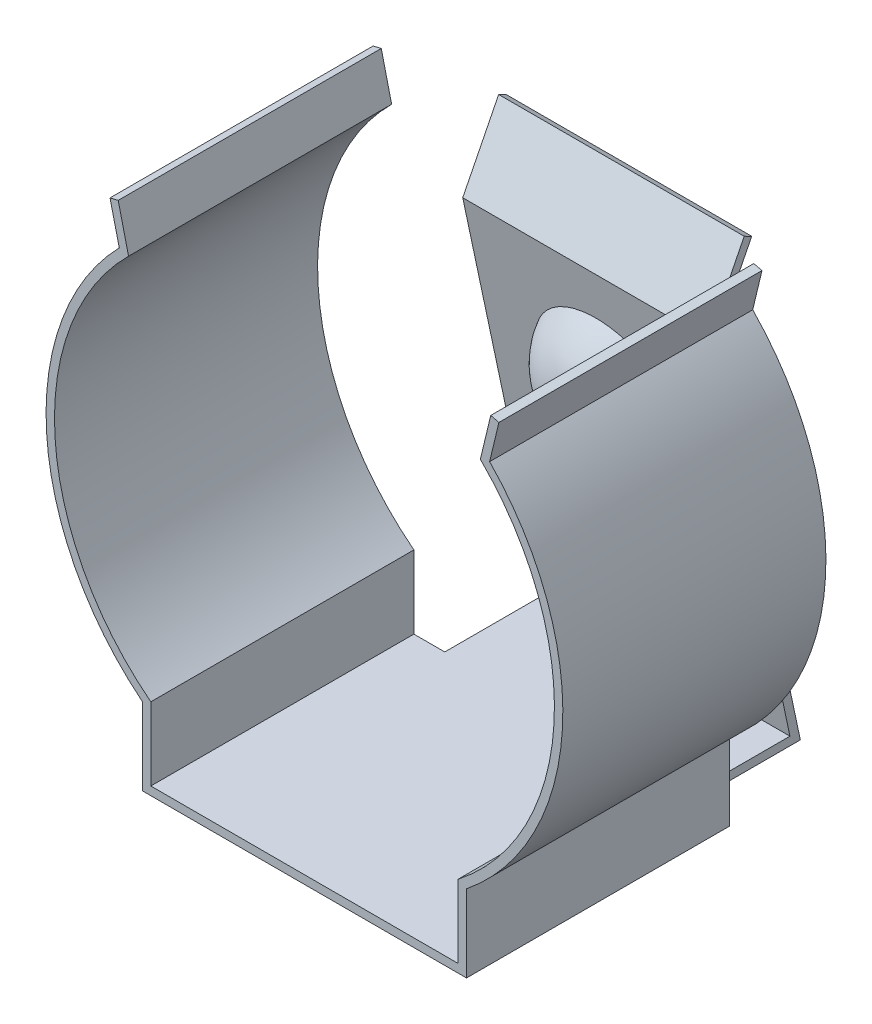
ISO-10303-21;
HEADER;
FILE_DESCRIPTION(('STEP AP214'),'2;1');
FILE_NAME('part.step','',(''),(''),'','','');
FILE_SCHEMA(('AUTOMOTIVE_DESIGN { 1 0 10303 214 1 1 1 1 }'));
ENDSEC;
DATA;
#1=APPLICATION_CONTEXT('core data for automotive mechanical design processes');
#2=APPLICATION_PROTOCOL_DEFINITION('international standard','automotive_design',2000,#1);
#3=PRODUCT_CONTEXT('',#1,'mechanical');
#4=PRODUCT('Part','Part','',(#3));
#5=PRODUCT_RELATED_PRODUCT_CATEGORY('part','',(#4));
#6=PRODUCT_DEFINITION_FORMATION('','',#4);
#7=PRODUCT_DEFINITION_CONTEXT('part definition',#1,'design');
#8=PRODUCT_DEFINITION('design','',#6,#7);
#9=PRODUCT_DEFINITION_SHAPE('','',#8);
#10=(LENGTH_UNIT() NAMED_UNIT(*) SI_UNIT(.MILLI.,.METRE.));
#11=(NAMED_UNIT(*) PLANE_ANGLE_UNIT() SI_UNIT($,.RADIAN.));
#12=(NAMED_UNIT(*) SI_UNIT($,.STERADIAN.) SOLID_ANGLE_UNIT());
#13=UNCERTAINTY_MEASURE_WITH_UNIT(LENGTH_MEASURE(1.E-05),#10,'distance_accuracy_value','');
#14=(GEOMETRIC_REPRESENTATION_CONTEXT(3) GLOBAL_UNCERTAINTY_ASSIGNED_CONTEXT((#13)) GLOBAL_UNIT_ASSIGNED_CONTEXT((#10,
#11,#12)) REPRESENTATION_CONTEXT('',''));
#15=CARTESIAN_POINT('',(0.,0.,0.));
#16=DIRECTION('',(0.,0.,1.));
#17=DIRECTION('',(1.,0.,0.));
#18=AXIS2_PLACEMENT_3D('',#15,#16,#17);
#19=CARTESIAN_POINT('',(4.445,0.,-3.6068));
#20=DIRECTION('',(0.,-0.207792207792208,0.978172990007821));
#21=DIRECTION('',(0.,-0.978172990007821,-0.207792207792208));
#22=AXIS2_PLACEMENT_3D('',#19,#20,#21);
#23=PLANE('',#22);
#24=DIRECTION('',(0.,0.978172990007821,0.207792207792208));
#25=VECTOR('',#24,1.);
#26=CARTESIAN_POINT('',(-4.445,0.,-3.6068));
#27=LINE('',#26,#25);
#28=CARTESIAN_POINT('',(-4.445,0.,-3.6068));
#29=VERTEX_POINT('',#28);
#30=CARTESIAN_POINT('',(-4.445,13.9164511431343,-0.650543655566343));
#31=VERTEX_POINT('',#30);
#32=EDGE_CURVE('E339',#29,#31,#27,.T.);
#33=ORIENTED_EDGE('',*,*,#32,.F.);
#34=DIRECTION('',(-1.,0.,0.));
#35=VECTOR('',#34,1.);
#36=CARTESIAN_POINT('',(4.445,0.,-3.6068));
#37=LINE('',#36,#35);
#38=CARTESIAN_POINT('',(4.445,0.,-3.6068));
#39=VERTEX_POINT('',#38);
#40=EDGE_CURVE('E359',#39,#29,#37,.T.);
#41=ORIENTED_EDGE('',*,*,#40,.F.);
#42=DIRECTION('',(0.,0.978172990007821,0.207792207792208));
#43=VECTOR('',#42,1.);
#44=CARTESIAN_POINT('',(4.445,0.,-3.6068));
#45=LINE('',#44,#43);
#46=CARTESIAN_POINT('',(4.445,13.9164511431343,-0.650543655566343));
#47=VERTEX_POINT('',#46);
#48=EDGE_CURVE('E406',#39,#47,#45,.T.);
#49=ORIENTED_EDGE('',*,*,#48,.T.);
#50=DIRECTION('',(-1.,0.,0.));
#51=VECTOR('',#50,1.);
#52=CARTESIAN_POINT('',(4.445,13.9164511431343,-0.650543655566343));
#53=LINE('',#52,#51);
#54=EDGE_CURVE('E362',#47,#31,#53,.T.);
#55=ORIENTED_EDGE('',*,*,#54,.T.);
#56=EDGE_LOOP('',(#33,#41,#49,#55));
#57=FACE_BOUND('',#56,.T.);
#58=CARTESIAN_POINT('',(2.89696051021412,4.24177401501011,-2.7057246313911));
#59=DIRECTION('',(0.,-0.207792207792208,0.978172990007821));
#60=DIRECTION('',(0.,-0.978172990007821,-0.207792207792208));
#61=AXIS2_PLACEMENT_3D('',#58,#59,#60);
#62=CIRCLE('',#61,0.7874);
#63=CARTESIAN_POINT('',(2.89696051021412,3.47156060267795,-2.86934021580668));
#64=VERTEX_POINT('',#63);
#65=EDGE_CURVE('E430',#64,#64,#62,.T.);
#66=ORIENTED_EDGE('',*,*,#65,.F.);
#67=EDGE_LOOP('',(#66));
#68=FACE_BOUND('',#67,.T.);
#69=CARTESIAN_POINT('',(0.,9.56555366928648,-1.5748));
#70=DIRECTION('',(0.,-0.207792207792208,0.978172990007821));
#71=DIRECTION('',(0.,-0.978172990007821,-0.207792207792208));
#72=AXIS2_PLACEMENT_3D('',#69,#70,#71);
#73=CIRCLE('',#72,2.6797);
#74=CARTESIAN_POINT('',(0.,6.94434350796252,-2.13162077922079));
#75=VERTEX_POINT('',#74);
#76=EDGE_CURVE('E472',#75,#75,#73,.T.);
#77=ORIENTED_EDGE('',*,*,#76,.F.);
#78=EDGE_LOOP('',(#77));
#79=FACE_BOUND('',#78,.T.);
#80=ADVANCED_FACE('F32',(#57,#68,#79),#23,.T.);
#81=CARTESIAN_POINT('',(0.,9.779,0.));
#82=DIRECTION('',(0.,0.,1.));
#83=DIRECTION('',(1.,0.,0.));
#84=AXIS2_PLACEMENT_3D('',#81,#82,#83);
#85=PLANE('',#84);
#86=DIRECTION('',(0.,1.,0.));
#87=VECTOR('',#86,1.);
#88=CARTESIAN_POINT('',(-4.445,-0.304800000000001,0.));
#89=LINE('',#88,#87);
#90=CARTESIAN_POINT('',(-4.445,-0.304800000000001,0.));
#91=VERTEX_POINT('',#90);
#92=CARTESIAN_POINT('',(-4.445,0.,0.));
#93=VERTEX_POINT('',#92);
#94=EDGE_CURVE('E325',#91,#93,#89,.T.);
#95=ORIENTED_EDGE('',*,*,#94,.F.);
#96=DIRECTION('',(1.,0.,0.));
#97=VECTOR('',#96,1.);
#98=CARTESIAN_POINT('',(5.5626,-0.304800000000001,0.));
#99=LINE('',#98,#97);
#100=CARTESIAN_POINT('',(-5.8674,-0.304800000000001,0.));
#101=VERTEX_POINT('',#100);
#102=EDGE_CURVE('E222',#101,#91,#99,.T.);
#103=ORIENTED_EDGE('',*,*,#102,.F.);
#104=DIRECTION('',(0.,-1.,0.));
#105=VECTOR('',#104,1.);
#106=CARTESIAN_POINT('',(-5.8674,2.64037399494833,0.));
#107=LINE('',#106,#105);
#108=CARTESIAN_POINT('',(-5.8674,2.49299284381356,0.));
#109=VERTEX_POINT('',#108);
#110=EDGE_CURVE('E223',#109,#101,#107,.T.);
#111=ORIENTED_EDGE('',*,*,#110,.F.);
#112=CARTESIAN_POINT('',(0.,9.779,0.));
#113=DIRECTION('',(0.,0.,1.));
#114=DIRECTION('',(1.,0.,0.));
#115=AXIS2_PLACEMENT_3D('',#112,#113,#114);
#116=CIRCLE('',#115,9.3548);
#117=CARTESIAN_POINT('',(-6.70456744584664,16.3028836902641,0.));
#118=VERTEX_POINT('',#117);
#119=EDGE_CURVE('E314',#118,#109,#116,.T.);
#120=ORIENTED_EDGE('',*,*,#119,.F.);
#121=DIRECTION('',(0.233312417506239,-0.972401828380323,0.));
#122=VECTOR('',#121,1.);
#123=CARTESIAN_POINT('',(-6.66495860588596,16.1378015707204,0.));
#124=LINE('',#123,#122);
#125=CARTESIAN_POINT('',(-7.04008807729032,17.7012699354644,0.));
#126=VERTEX_POINT('',#125);
#127=EDGE_CURVE('E765',#126,#118,#124,.T.);
#128=ORIENTED_EDGE('',*,*,#127,.F.);
#129=DIRECTION('',(0.972401828380323,0.233312417506236,0.));
#130=VECTOR('',#129,1.);
#131=CARTESIAN_POINT('',(-7.04008807729032,17.7012699354644,0.));
#132=LINE('',#131,#130);
#133=CARTESIAN_POINT('',(-6.7437,17.7723835603203,0.));
#134=VERTEX_POINT('',#133);
#135=EDGE_CURVE('E763',#126,#134,#132,.T.);
#136=ORIENTED_EDGE('',*,*,#135,.T.);
#137=DIRECTION('',(0.233312417506239,-0.972401828380323,0.));
#138=VECTOR('',#137,1.);
#139=CARTESIAN_POINT('',(-6.36857052859564,16.2089151955763,0.));
#140=LINE('',#139,#138);
#141=CARTESIAN_POINT('',(-6.36857052859564,16.2089151955763,0.));
#142=VERTEX_POINT('',#141);
#143=EDGE_CURVE('E760',#134,#142,#140,.T.);
#144=ORIENTED_EDGE('',*,*,#143,.T.);
#145=CARTESIAN_POINT('',(0.,9.779,0.));
#146=DIRECTION('',(0.,0.,1.));
#147=DIRECTION('',(-1.,0.,0.));
#148=AXIS2_PLACEMENT_3D('',#145,#146,#147);
#149=CIRCLE('',#148,9.05);
#150=CARTESIAN_POINT('',(-5.5626,2.64037399494833,0.));
#151=VERTEX_POINT('',#150);
#152=EDGE_CURVE('E757',#142,#151,#149,.T.);
#153=ORIENTED_EDGE('',*,*,#152,.T.);
#154=DIRECTION('',(0.,-1.,0.));
#155=VECTOR('',#154,1.);
#156=CARTESIAN_POINT('',(-5.5626,2.64037399494833,0.));
#157=LINE('',#156,#155);
#158=CARTESIAN_POINT('',(-5.5626,0.,0.));
#159=VERTEX_POINT('',#158);
#160=EDGE_CURVE('E211',#151,#159,#157,.T.);
#161=ORIENTED_EDGE('',*,*,#160,.T.);
#162=DIRECTION('',(1.,0.,0.));
#163=VECTOR('',#162,1.);
#164=CARTESIAN_POINT('',(5.5626,0.,0.));
#165=LINE('',#164,#163);
#166=EDGE_CURVE('E217',#159,#93,#165,.T.);
#167=ORIENTED_EDGE('',*,*,#166,.T.);
#168=EDGE_LOOP('',(#95,#103,#111,#120,#128,#136,#144,#153,#161,#167));
#169=FACE_BOUND('',#168,.T.);
#170=ADVANCED_FACE('F323',(#169),#85,.F.);
#171=CARTESIAN_POINT('',(6.66495860588596,16.1378015707204,9.525));
#172=DIRECTION('',(-0.972401828380323,0.233312417506239,0.));
#173=DIRECTION('',(-0.233312417506239,-0.972401828380323,0.));
#174=AXIS2_PLACEMENT_3D('',#171,#172,#173);
#175=PLANE('',#174);
#176=DIRECTION('',(0.233312417506239,0.972401828380323,0.));
#177=VECTOR('',#176,1.);
#178=CARTESIAN_POINT('',(6.66495860588596,16.1378015707204,0.));
#179=LINE('',#178,#177);
#180=CARTESIAN_POINT('',(6.70456744584664,16.3028836902641,0.));
#181=VERTEX_POINT('',#180);
#182=CARTESIAN_POINT('',(7.04008807729032,17.7012699354644,0.));
#183=VERTEX_POINT('',#182);
#184=EDGE_CURVE('E192',#181,#183,#179,.T.);
#185=ORIENTED_EDGE('',*,*,#184,.T.);
#186=DIRECTION('',(0.,0.,-1.));
#187=VECTOR('',#186,1.);
#188=CARTESIAN_POINT('',(7.04008807729032,17.7012699354644,9.525));
#189=LINE('',#188,#187);
#190=CARTESIAN_POINT('',(7.04008807729032,17.7012699354644,9.525));
#191=VERTEX_POINT('',#190);
#192=EDGE_CURVE('E11',#191,#183,#189,.T.);
#193=ORIENTED_EDGE('',*,*,#192,.F.);
#194=DIRECTION('',(0.233312417506239,0.972401828380323,0.));
#195=VECTOR('',#194,1.);
#196=CARTESIAN_POINT('',(6.66495860588596,16.1378015707204,9.525));
#197=LINE('',#196,#195);
#198=CARTESIAN_POINT('',(6.70456744584664,16.3028836902641,9.525));
#199=VERTEX_POINT('',#198);
#200=EDGE_CURVE('E120',#199,#191,#197,.T.);
#201=ORIENTED_EDGE('',*,*,#200,.F.);
#202=DIRECTION('',(0.,0.,-1.));
#203=VECTOR('',#202,1.);
#204=CARTESIAN_POINT('',(6.70456744584664,16.3028836902641,9.525));
#205=LINE('',#204,#203);
#206=EDGE_CURVE('E188',#199,#181,#205,.T.);
#207=ORIENTED_EDGE('',*,*,#206,.T.);
#208=EDGE_LOOP('',(#185,#193,#201,#207));
#209=FACE_BOUND('',#208,.T.);
#210=ADVANCED_FACE('F34',(#209),#175,.F.);
#211=CARTESIAN_POINT('',(6.7437,17.7723835603203,9.525));
#212=DIRECTION('',(0.233312417506236,0.972401828380323,0.));
#213=DIRECTION('',(-0.972401828380323,0.233312417506236,0.));
#214=AXIS2_PLACEMENT_3D('',#211,#212,#213);
#215=PLANE('',#214);
#216=DIRECTION('',(0.972401828380323,-0.233312417506236,0.));
#217=VECTOR('',#216,1.);
#218=CARTESIAN_POINT('',(6.7437,17.7723835603203,0.));
#219=LINE('',#218,#217);
#220=CARTESIAN_POINT('',(6.7437,17.7723835603203,0.));
#221=VERTEX_POINT('',#220);
#222=EDGE_CURVE('E195',#221,#183,#219,.T.);
#223=ORIENTED_EDGE('',*,*,#222,.F.);
#224=DIRECTION('',(0.,0.,-1.));
#225=VECTOR('',#224,1.);
#226=CARTESIAN_POINT('',(6.7437,17.7723835603203,9.525));
#227=LINE('',#226,#225);
#228=CARTESIAN_POINT('',(6.7437,17.7723835603203,9.525));
#229=VERTEX_POINT('',#228);
#230=EDGE_CURVE('E41',#229,#221,#227,.T.);
#231=ORIENTED_EDGE('',*,*,#230,.F.);
#232=DIRECTION('',(0.972401828380323,-0.233312417506236,0.));
#233=VECTOR('',#232,1.);
#234=CARTESIAN_POINT('',(6.7437,17.7723835603203,9.525));
#235=LINE('',#234,#233);
#236=EDGE_CURVE('E280',#229,#191,#235,.T.);
#237=ORIENTED_EDGE('',*,*,#236,.T.);
#238=ORIENTED_EDGE('',*,*,#192,.T.);
#239=EDGE_LOOP('',(#223,#231,#237,#238));
#240=FACE_BOUND('',#239,.T.);
#241=ADVANCED_FACE('F267',(#240),#215,.T.);
#242=CARTESIAN_POINT('',(6.36857052859564,16.2089151955763,9.525));
#243=DIRECTION('',(-0.972401828380323,0.233312417506239,0.));
#244=DIRECTION('',(-0.233312417506239,-0.972401828380323,0.));
#245=AXIS2_PLACEMENT_3D('',#242,#243,#244);
#246=PLANE('',#245);
#247=DIRECTION('',(0.233312417506239,0.972401828380323,0.));
#248=VECTOR('',#247,1.);
#249=CARTESIAN_POINT('',(6.36857052859564,16.2089151955763,0.));
#250=LINE('',#249,#248);
#251=CARTESIAN_POINT('',(6.36857052859564,16.2089151955763,0.));
#252=VERTEX_POINT('',#251);
#253=EDGE_CURVE('E199',#252,#221,#250,.T.);
#254=ORIENTED_EDGE('',*,*,#253,.F.);
#255=DIRECTION('',(0.,0.,-1.));
#256=VECTOR('',#255,1.);
#257=CARTESIAN_POINT('',(6.36857052859564,16.2089151955763,9.525));
#258=LINE('',#257,#256);
#259=CARTESIAN_POINT('',(6.36857052859564,16.2089151955763,9.525));
#260=VERTEX_POINT('',#259);
#261=EDGE_CURVE('E256',#260,#252,#258,.T.);
#262=ORIENTED_EDGE('',*,*,#261,.F.);
#263=DIRECTION('',(0.233312417506239,0.972401828380323,0.));
#264=VECTOR('',#263,1.);
#265=CARTESIAN_POINT('',(6.36857052859564,16.2089151955763,9.525));
#266=LINE('',#265,#264);
#267=EDGE_CURVE('E264',#260,#229,#266,.T.);
#268=ORIENTED_EDGE('',*,*,#267,.T.);
#269=ORIENTED_EDGE('',*,*,#230,.T.);
#270=EDGE_LOOP('',(#254,#262,#268,#269));
#271=FACE_BOUND('',#270,.T.);
#272=ADVANCED_FACE('F262',(#271),#246,.T.);
#273=CARTESIAN_POINT('',(0.,9.779,9.525));
#274=DIRECTION('',(0.,0.,-1.));
#275=DIRECTION('',(-1.,0.,0.));
#276=AXIS2_PLACEMENT_3D('',#273,#274,#275);
#277=CYLINDRICAL_SURFACE('',#276,9.05);
#278=CARTESIAN_POINT('',(0.,9.779,0.));
#279=DIRECTION('',(0.,0.,1.));
#280=DIRECTION('',(1.,0.,0.));
#281=AXIS2_PLACEMENT_3D('',#278,#279,#280);
#282=CIRCLE('',#281,9.05);
#283=CARTESIAN_POINT('',(5.5626,2.64037399494833,0.));
#284=VERTEX_POINT('',#283);
#285=EDGE_CURVE('E202',#284,#252,#282,.T.);
#286=ORIENTED_EDGE('',*,*,#285,.F.);
#287=DIRECTION('',(0.,0.,-1.));
#288=VECTOR('',#287,1.);
#289=CARTESIAN_POINT('',(5.5626,2.64037399494833,9.525));
#290=LINE('',#289,#288);
#291=CARTESIAN_POINT('',(5.5626,2.64037399494833,9.525));
#292=VERTEX_POINT('',#291);
#293=EDGE_CURVE('E254',#292,#284,#290,.T.);
#294=ORIENTED_EDGE('',*,*,#293,.F.);
#295=CARTESIAN_POINT('',(0.,9.779,9.525));
#296=DIRECTION('',(0.,0.,1.));
#297=DIRECTION('',(1.,0.,0.));
#298=AXIS2_PLACEMENT_3D('',#295,#296,#297);
#299=CIRCLE('',#298,9.05);
#300=EDGE_CURVE('E277',#292,#260,#299,.T.);
#301=ORIENTED_EDGE('',*,*,#300,.T.);
#302=ORIENTED_EDGE('',*,*,#261,.T.);
#303=EDGE_LOOP('',(#286,#294,#301,#302));
#304=FACE_BOUND('',#303,.T.);
#305=ADVANCED_FACE('F274',(#304),#277,.F.);
#306=CARTESIAN_POINT('',(5.5626,2.64037399494833,9.525));
#307=DIRECTION('',(-1.,0.,0.));
#308=DIRECTION('',(0.,-1.,0.));
#309=AXIS2_PLACEMENT_3D('',#306,#307,#308);
#310=PLANE('',#309);
#311=DIRECTION('',(0.,1.,0.));
#312=VECTOR('',#311,1.);
#313=CARTESIAN_POINT('',(5.5626,2.64037399494833,0.));
#314=LINE('',#313,#312);
#315=CARTESIAN_POINT('',(5.5626,0.,0.));
#316=VERTEX_POINT('',#315);
#317=EDGE_CURVE('E205',#316,#284,#314,.T.);
#318=ORIENTED_EDGE('',*,*,#317,.F.);
#319=DIRECTION('',(0.,0.,-1.));
#320=VECTOR('',#319,1.);
#321=CARTESIAN_POINT('',(5.5626,0.,9.525));
#322=LINE('',#321,#320);
#323=CARTESIAN_POINT('',(5.5626,0.,9.525));
#324=VERTEX_POINT('',#323);
#325=EDGE_CURVE('E251',#324,#316,#322,.T.);
#326=ORIENTED_EDGE('',*,*,#325,.F.);
#327=DIRECTION('',(0.,1.,0.));
#328=VECTOR('',#327,1.);
#329=CARTESIAN_POINT('',(5.5626,2.64037399494833,9.525));
#330=LINE('',#329,#328);
#331=EDGE_CURVE('E282',#324,#292,#330,.T.);
#332=ORIENTED_EDGE('',*,*,#331,.T.);
#333=ORIENTED_EDGE('',*,*,#293,.T.);
#334=EDGE_LOOP('',(#318,#326,#332,#333));
#335=FACE_BOUND('',#334,.T.);
#336=ADVANCED_FACE('F552',(#335),#310,.T.);
#337=CARTESIAN_POINT('',(5.5626,0.,9.525));
#338=DIRECTION('',(0.,1.,0.));
#339=DIRECTION('',(0.,0.,1.));
#340=AXIS2_PLACEMENT_3D('',#337,#338,#339);
#341=PLANE('',#340);
#342=ORIENTED_EDGE('',*,*,#166,.F.);
#343=DIRECTION('',(0.,0.,-1.));
#344=VECTOR('',#343,1.);
#345=CARTESIAN_POINT('',(-5.5626,0.,9.525));
#346=LINE('',#345,#344);
#347=CARTESIAN_POINT('',(-5.5626,0.,9.525));
#348=VERTEX_POINT('',#347);
#349=EDGE_CURVE('E249',#348,#159,#346,.T.);
#350=ORIENTED_EDGE('',*,*,#349,.F.);
#351=DIRECTION('',(1.,0.,0.));
#352=VECTOR('',#351,1.);
#353=CARTESIAN_POINT('',(5.5626,0.,9.525));
#354=LINE('',#353,#352);
#355=EDGE_CURVE('E288',#348,#324,#354,.T.);
#356=ORIENTED_EDGE('',*,*,#355,.T.);
#357=ORIENTED_EDGE('',*,*,#325,.T.);
#358=CARTESIAN_POINT('',(4.445,0.,0.));
#359=VERTEX_POINT('',#358);
#360=EDGE_CURVE('E208',#359,#316,#165,.T.);
#361=ORIENTED_EDGE('',*,*,#360,.F.);
#362=DIRECTION('',(0.,0.,-1.));
#363=VECTOR('',#362,1.);
#364=CARTESIAN_POINT('',(4.445,0.,0.));
#365=LINE('',#364,#363);
#366=EDGE_CURVE('E49',#359,#39,#365,.T.);
#367=ORIENTED_EDGE('',*,*,#366,.T.);
#368=ORIENTED_EDGE('',*,*,#40,.T.);
#369=DIRECTION('',(0.,0.,-1.));
#370=VECTOR('',#369,1.);
#371=CARTESIAN_POINT('',(-4.445,0.,0.));
#372=LINE('',#371,#370);
#373=EDGE_CURVE('E335',#93,#29,#372,.T.);
#374=ORIENTED_EDGE('',*,*,#373,.F.);
#375=EDGE_LOOP('',(#342,#350,#356,#357,#361,#367,#368,#374));
#376=FACE_BOUND('',#375,.T.);
#377=ADVANCED_FACE('F449',(#376),#341,.T.);
#378=CARTESIAN_POINT('',(-5.5626,2.64037399494833,9.525));
#379=DIRECTION('',(1.,0.,0.));
#380=DIRECTION('',(0.,1.,0.));
#381=AXIS2_PLACEMENT_3D('',#378,#379,#380);
#382=PLANE('',#381);
#383=ORIENTED_EDGE('',*,*,#160,.F.);
#384=DIRECTION('',(0.,0.,-1.));
#385=VECTOR('',#384,1.);
#386=CARTESIAN_POINT('',(-5.5626,2.64037399494833,9.525));
#387=LINE('',#386,#385);
#388=CARTESIAN_POINT('',(-5.5626,2.64037399494833,9.525));
#389=VERTEX_POINT('',#388);
#390=EDGE_CURVE('E247',#389,#151,#387,.T.);
#391=ORIENTED_EDGE('',*,*,#390,.F.);
#392=DIRECTION('',(0.,-1.,0.));
#393=VECTOR('',#392,1.);
#394=CARTESIAN_POINT('',(-5.5626,2.64037399494833,9.525));
#395=LINE('',#394,#393);
#396=EDGE_CURVE('E291',#389,#348,#395,.T.);
#397=ORIENTED_EDGE('',*,*,#396,.T.);
#398=ORIENTED_EDGE('',*,*,#349,.T.);
#399=EDGE_LOOP('',(#383,#391,#397,#398));
#400=FACE_BOUND('',#399,.T.);
#401=ADVANCED_FACE('F545',(#400),#382,.T.);
#402=CARTESIAN_POINT('',(0.,9.779,9.525));
#403=DIRECTION('',(0.,0.,-1.));
#404=DIRECTION('',(-1.,0.,0.));
#405=AXIS2_PLACEMENT_3D('',#402,#403,#404);
#406=CYLINDRICAL_SURFACE('',#405,9.05);
#407=ORIENTED_EDGE('',*,*,#152,.F.);
#408=DIRECTION('',(0.,0.,-1.));
#409=VECTOR('',#408,1.);
#410=CARTESIAN_POINT('',(-6.36857052859564,16.2089151955763,9.525));
#411=LINE('',#410,#409);
#412=CARTESIAN_POINT('',(-6.36857052859564,16.2089151955763,9.525));
#413=VERTEX_POINT('',#412);
#414=EDGE_CURVE('E245',#413,#142,#411,.T.);
#415=ORIENTED_EDGE('',*,*,#414,.F.);
#416=CARTESIAN_POINT('',(0.,9.779,9.525));
#417=DIRECTION('',(0.,0.,1.));
#418=DIRECTION('',(-1.,0.,0.));
#419=AXIS2_PLACEMENT_3D('',#416,#417,#418);
#420=CIRCLE('',#419,9.05);
#421=EDGE_CURVE('E294',#413,#389,#420,.T.);
#422=ORIENTED_EDGE('',*,*,#421,.T.);
#423=ORIENTED_EDGE('',*,*,#390,.T.);
#424=EDGE_LOOP('',(#407,#415,#422,#423));
#425=FACE_BOUND('',#424,.T.);
#426=ADVANCED_FACE('F541',(#425),#406,.F.);
#427=CARTESIAN_POINT('',(-6.36857052859564,16.2089151955763,9.525));
#428=DIRECTION('',(0.972401828380323,0.233312417506239,0.));
#429=DIRECTION('',(-0.233312417506239,0.972401828380323,0.));
#430=AXIS2_PLACEMENT_3D('',#427,#428,#429);
#431=PLANE('',#430);
#432=ORIENTED_EDGE('',*,*,#143,.F.);
#433=DIRECTION('',(0.,0.,-1.));
#434=VECTOR('',#433,1.);
#435=CARTESIAN_POINT('',(-6.7437,17.7723835603203,9.525));
#436=LINE('',#435,#434);
#437=CARTESIAN_POINT('',(-6.7437,17.7723835603203,9.525));
#438=VERTEX_POINT('',#437);
#439=EDGE_CURVE('E243',#438,#134,#436,.T.);
#440=ORIENTED_EDGE('',*,*,#439,.F.);
#441=DIRECTION('',(0.233312417506239,-0.972401828380323,0.));
#442=VECTOR('',#441,1.);
#443=CARTESIAN_POINT('',(-6.36857052859564,16.2089151955763,9.525));
#444=LINE('',#443,#442);
#445=EDGE_CURVE('E297',#438,#413,#444,.T.);
#446=ORIENTED_EDGE('',*,*,#445,.T.);
#447=ORIENTED_EDGE('',*,*,#414,.T.);
#448=EDGE_LOOP('',(#432,#440,#446,#447));
#449=FACE_BOUND('',#448,.T.);
#450=ADVANCED_FACE('F537',(#449),#431,.T.);
#451=CARTESIAN_POINT('',(-7.04008807729032,17.7012699354644,9.525));
#452=DIRECTION('',(-0.233312417506236,0.972401828380323,0.));
#453=DIRECTION('',(-0.972401828380323,-0.233312417506236,0.));
#454=AXIS2_PLACEMENT_3D('',#451,#452,#453);
#455=PLANE('',#454);
#456=ORIENTED_EDGE('',*,*,#135,.F.);
#457=DIRECTION('',(0.,0.,-1.));
#458=VECTOR('',#457,1.);
#459=CARTESIAN_POINT('',(-7.04008807729032,17.7012699354644,9.525));
#460=LINE('',#459,#458);
#461=CARTESIAN_POINT('',(-7.04008807729032,17.7012699354644,9.525));
#462=VERTEX_POINT('',#461);
#463=EDGE_CURVE('E241',#462,#126,#460,.T.);
#464=ORIENTED_EDGE('',*,*,#463,.F.);
#465=DIRECTION('',(0.972401828380323,0.233312417506236,0.));
#466=VECTOR('',#465,1.);
#467=CARTESIAN_POINT('',(-7.04008807729032,17.7012699354644,9.525));
#468=LINE('',#467,#466);
#469=EDGE_CURVE('E300',#462,#438,#468,.T.);
#470=ORIENTED_EDGE('',*,*,#469,.T.);
#471=ORIENTED_EDGE('',*,*,#439,.T.);
#472=EDGE_LOOP('',(#456,#464,#470,#471));
#473=FACE_BOUND('',#472,.T.);
#474=ADVANCED_FACE('F533',(#473),#455,.T.);
#475=CARTESIAN_POINT('',(-6.66495860588596,16.1378015707204,9.525));
#476=DIRECTION('',(0.972401828380323,0.233312417506239,0.));
#477=DIRECTION('',(-0.233312417506239,0.972401828380323,0.));
#478=AXIS2_PLACEMENT_3D('',#475,#476,#477);
#479=PLANE('',#478);
#480=ORIENTED_EDGE('',*,*,#127,.T.);
#481=DIRECTION('',(0.,0.,-1.));
#482=VECTOR('',#481,1.);
#483=CARTESIAN_POINT('',(-6.70456744584664,16.3028836902641,9.525));
#484=LINE('',#483,#482);
#485=CARTESIAN_POINT('',(-6.70456744584664,16.3028836902641,9.525));
#486=VERTEX_POINT('',#485);
#487=EDGE_CURVE('E238',#486,#118,#484,.T.);
#488=ORIENTED_EDGE('',*,*,#487,.F.);
#489=DIRECTION('',(0.233312417506239,-0.972401828380323,0.));
#490=VECTOR('',#489,1.);
#491=CARTESIAN_POINT('',(-6.66495860588596,16.1378015707204,9.525));
#492=LINE('',#491,#490);
#493=EDGE_CURVE('E303',#462,#486,#492,.T.);
#494=ORIENTED_EDGE('',*,*,#493,.F.);
#495=ORIENTED_EDGE('',*,*,#463,.T.);
#496=EDGE_LOOP('',(#480,#488,#494,#495));
#497=FACE_BOUND('',#496,.T.);
#498=ADVANCED_FACE('F530',(#497),#479,.F.);
#499=CARTESIAN_POINT('',(0.,9.779,9.525));
#500=DIRECTION('',(0.,0.,-1.));
#501=DIRECTION('',(-1.,0.,0.));
#502=AXIS2_PLACEMENT_3D('',#499,#500,#501);
#503=CYLINDRICAL_SURFACE('',#502,9.3548);
#504=ORIENTED_EDGE('',*,*,#119,.T.);
#505=DIRECTION('',(0.,0.,-1.));
#506=VECTOR('',#505,1.);
#507=CARTESIAN_POINT('',(-5.8674,2.49299284381356,9.525));
#508=LINE('',#507,#506);
#509=CARTESIAN_POINT('',(-5.8674,2.49299284381356,9.525));
#510=VERTEX_POINT('',#509);
#511=EDGE_CURVE('E235',#510,#109,#508,.T.);
#512=ORIENTED_EDGE('',*,*,#511,.F.);
#513=CARTESIAN_POINT('',(0.,9.779,9.525));
#514=DIRECTION('',(0.,0.,1.));
#515=DIRECTION('',(1.,0.,0.));
#516=AXIS2_PLACEMENT_3D('',#513,#514,#515);
#517=CIRCLE('',#516,9.3548);
#518=EDGE_CURVE('E305',#486,#510,#517,.T.);
#519=ORIENTED_EDGE('',*,*,#518,.F.);
#520=ORIENTED_EDGE('',*,*,#487,.T.);
#521=EDGE_LOOP('',(#504,#512,#519,#520));
#522=FACE_BOUND('',#521,.T.);
#523=ADVANCED_FACE('F312',(#522),#503,.T.);
#524=CARTESIAN_POINT('',(-5.8674,2.64037399494833,9.525));
#525=DIRECTION('',(1.,0.,0.));
#526=DIRECTION('',(0.,1.,0.));
#527=AXIS2_PLACEMENT_3D('',#524,#525,#526);
#528=PLANE('',#527);
#529=ORIENTED_EDGE('',*,*,#110,.T.);
#530=DIRECTION('',(0.,0.,-1.));
#531=VECTOR('',#530,1.);
#532=CARTESIAN_POINT('',(-5.8674,-0.304800000000001,9.525));
#533=LINE('',#532,#531);
#534=CARTESIAN_POINT('',(-5.8674,-0.304800000000001,9.525));
#535=VERTEX_POINT('',#534);
#536=EDGE_CURVE('E183',#535,#101,#533,.T.);
#537=ORIENTED_EDGE('',*,*,#536,.F.);
#538=DIRECTION('',(0.,-1.,0.));
#539=VECTOR('',#538,1.);
#540=CARTESIAN_POINT('',(-5.8674,2.64037399494833,9.525));
#541=LINE('',#540,#539);
#542=EDGE_CURVE('E169',#510,#535,#541,.T.);
#543=ORIENTED_EDGE('',*,*,#542,.F.);
#544=ORIENTED_EDGE('',*,*,#511,.T.);
#545=EDGE_LOOP('',(#529,#537,#543,#544));
#546=FACE_BOUND('',#545,.T.);
#547=ADVANCED_FACE('F317',(#546),#528,.F.);
#548=CARTESIAN_POINT('',(5.5626,-0.304800000000001,9.525));
#549=DIRECTION('',(0.,1.,0.));
#550=DIRECTION('',(0.,0.,1.));
#551=AXIS2_PLACEMENT_3D('',#548,#549,#550);
#552=PLANE('',#551);
#553=ORIENTED_EDGE('',*,*,#102,.T.);
#554=DIRECTION('',(0.,0.,-1.));
#555=VECTOR('',#554,1.);
#556=CARTESIAN_POINT('',(-4.445,-0.304800000000001,0.));
#557=LINE('',#556,#555);
#558=CARTESIAN_POINT('',(-4.445,-0.3048,-3.98314965256209));
#559=VERTEX_POINT('',#558);
#560=EDGE_CURVE('E334',#91,#559,#557,.T.);
#561=ORIENTED_EDGE('',*,*,#560,.T.);
#562=DIRECTION('',(-1.,0.,0.));
#563=VECTOR('',#562,1.);
#564=CARTESIAN_POINT('',(4.445,-0.3048,-3.98314965256209));
#565=LINE('',#564,#563);
#566=CARTESIAN_POINT('',(4.445,-0.3048,-3.98314965256209));
#567=VERTEX_POINT('',#566);
#568=EDGE_CURVE('E355',#567,#559,#565,.T.);
#569=ORIENTED_EDGE('',*,*,#568,.F.);
#570=DIRECTION('',(0.,0.,-1.));
#571=VECTOR('',#570,1.);
#572=CARTESIAN_POINT('',(4.445,-0.304800000000001,0.));
#573=LINE('',#572,#571);
#574=CARTESIAN_POINT('',(4.445,-0.304800000000001,0.));
#575=VERTEX_POINT('',#574);
#576=EDGE_CURVE('E403',#575,#567,#573,.T.);
#577=ORIENTED_EDGE('',*,*,#576,.F.);
#578=CARTESIAN_POINT('',(5.8674,-0.304800000000001,0.));
#579=VERTEX_POINT('',#578);
#580=EDGE_CURVE('E180',#575,#579,#99,.T.);
#581=ORIENTED_EDGE('',*,*,#580,.T.);
#582=DIRECTION('',(0.,0.,-1.));
#583=VECTOR('',#582,1.);
#584=CARTESIAN_POINT('',(5.8674,-0.304800000000001,9.525));
#585=LINE('',#584,#583);
#586=CARTESIAN_POINT('',(5.8674,-0.304800000000001,9.525));
#587=VERTEX_POINT('',#586);
#588=EDGE_CURVE('E175',#587,#579,#585,.T.);
#589=ORIENTED_EDGE('',*,*,#588,.F.);
#590=DIRECTION('',(1.,0.,0.));
#591=VECTOR('',#590,1.);
#592=CARTESIAN_POINT('',(5.5626,-0.304800000000001,9.525));
#593=LINE('',#592,#591);
#594=EDGE_CURVE('E162',#535,#587,#593,.T.);
#595=ORIENTED_EDGE('',*,*,#594,.F.);
#596=ORIENTED_EDGE('',*,*,#536,.T.);
#597=EDGE_LOOP('',(#553,#561,#569,#577,#581,#589,#595,#596));
#598=FACE_BOUND('',#597,.T.);
#599=ADVANCED_FACE('F177',(#598),#552,.F.);
#600=CARTESIAN_POINT('',(5.8674,2.64037399494833,9.525));
#601=DIRECTION('',(-1.,0.,0.));
#602=DIRECTION('',(0.,-1.,0.));
#603=AXIS2_PLACEMENT_3D('',#600,#601,#602);
#604=PLANE('',#603);
#605=DIRECTION('',(0.,1.,0.));
#606=VECTOR('',#605,1.);
#607=CARTESIAN_POINT('',(5.8674,2.64037399494833,0.));
#608=LINE('',#607,#606);
#609=CARTESIAN_POINT('',(5.8674,2.49299284381356,0.));
#610=VERTEX_POINT('',#609);
#611=EDGE_CURVE('E228',#579,#610,#608,.T.);
#612=ORIENTED_EDGE('',*,*,#611,.T.);
#613=DIRECTION('',(0.,0.,-1.));
#614=VECTOR('',#613,1.);
#615=CARTESIAN_POINT('',(5.8674,2.49299284381356,9.525));
#616=LINE('',#615,#614);
#617=CARTESIAN_POINT('',(5.8674,2.49299284381356,9.525));
#618=VERTEX_POINT('',#617);
#619=EDGE_CURVE('E184',#618,#610,#616,.T.);
#620=ORIENTED_EDGE('',*,*,#619,.F.);
#621=DIRECTION('',(0.,1.,0.));
#622=VECTOR('',#621,1.);
#623=CARTESIAN_POINT('',(5.8674,2.64037399494833,9.525));
#624=LINE('',#623,#622);
#625=EDGE_CURVE('E166',#587,#618,#624,.T.);
#626=ORIENTED_EDGE('',*,*,#625,.F.);
#627=ORIENTED_EDGE('',*,*,#588,.T.);
#628=EDGE_LOOP('',(#612,#620,#626,#627));
#629=FACE_BOUND('',#628,.T.);
#630=ADVANCED_FACE('F186',(#629),#604,.F.);
#631=CARTESIAN_POINT('',(0.,9.779,9.525));
#632=DIRECTION('',(0.,0.,-1.));
#633=DIRECTION('',(-1.,0.,0.));
#634=AXIS2_PLACEMENT_3D('',#631,#632,#633);
#635=CYLINDRICAL_SURFACE('',#634,9.3548);
#636=CARTESIAN_POINT('',(0.,9.779,0.));
#637=DIRECTION('',(0.,0.,1.));
#638=DIRECTION('',(1.,0.,0.));
#639=AXIS2_PLACEMENT_3D('',#636,#637,#638);
#640=CIRCLE('',#639,9.3548);
#641=EDGE_CURVE('E114',#610,#181,#640,.T.);
#642=ORIENTED_EDGE('',*,*,#641,.T.);
#643=ORIENTED_EDGE('',*,*,#206,.F.);
#644=CARTESIAN_POINT('',(0.,9.779,9.525));
#645=DIRECTION('',(0.,0.,1.));
#646=DIRECTION('',(1.,0.,0.));
#647=AXIS2_PLACEMENT_3D('',#644,#645,#646);
#648=CIRCLE('',#647,9.3548);
#649=EDGE_CURVE('E58',#618,#199,#648,.T.);
#650=ORIENTED_EDGE('',*,*,#649,.F.);
#651=ORIENTED_EDGE('',*,*,#619,.T.);
#652=EDGE_LOOP('',(#642,#643,#650,#651));
#653=FACE_BOUND('',#652,.T.);
#654=ADVANCED_FACE('F517',(#653),#635,.T.);
#655=CARTESIAN_POINT('',(0.,9.779,9.525));
#656=DIRECTION('',(0.,0.,1.));
#657=DIRECTION('',(1.,0.,0.));
#658=AXIS2_PLACEMENT_3D('',#655,#656,#657);
#659=PLANE('',#658);
#660=ORIENTED_EDGE('',*,*,#200,.T.);
#661=ORIENTED_EDGE('',*,*,#236,.F.);
#662=ORIENTED_EDGE('',*,*,#267,.F.);
#663=ORIENTED_EDGE('',*,*,#300,.F.);
#664=ORIENTED_EDGE('',*,*,#331,.F.);
#665=ORIENTED_EDGE('',*,*,#355,.F.);
#666=ORIENTED_EDGE('',*,*,#396,.F.);
#667=ORIENTED_EDGE('',*,*,#421,.F.);
#668=ORIENTED_EDGE('',*,*,#445,.F.);
#669=ORIENTED_EDGE('',*,*,#469,.F.);
#670=ORIENTED_EDGE('',*,*,#493,.T.);
#671=ORIENTED_EDGE('',*,*,#518,.T.);
#672=ORIENTED_EDGE('',*,*,#542,.T.);
#673=ORIENTED_EDGE('',*,*,#594,.T.);
#674=ORIENTED_EDGE('',*,*,#625,.T.);
#675=ORIENTED_EDGE('',*,*,#649,.T.);
#676=EDGE_LOOP('',(#660,#661,#662,#663,#664,#665,#666,#667,#668,#669,#670,#671,#672,#673,#674,#675));
#677=FACE_BOUND('',#676,.T.);
#678=ADVANCED_FACE('F164',(#677),#659,.T.);
#679=ORIENTED_EDGE('',*,*,#580,.F.);
#680=DIRECTION('',(0.,1.,0.));
#681=VECTOR('',#680,1.);
#682=CARTESIAN_POINT('',(4.445,-0.304800000000001,0.));
#683=LINE('',#682,#681);
#684=EDGE_CURVE('E408',#575,#359,#683,.T.);
#685=ORIENTED_EDGE('',*,*,#684,.T.);
#686=ORIENTED_EDGE('',*,*,#360,.T.);
#687=ORIENTED_EDGE('',*,*,#317,.T.);
#688=ORIENTED_EDGE('',*,*,#285,.T.);
#689=ORIENTED_EDGE('',*,*,#253,.T.);
#690=ORIENTED_EDGE('',*,*,#222,.T.);
#691=ORIENTED_EDGE('',*,*,#184,.F.);
#692=ORIENTED_EDGE('',*,*,#641,.F.);
#693=ORIENTED_EDGE('',*,*,#611,.F.);
#694=EDGE_LOOP('',(#679,#685,#686,#687,#688,#689,#690,#691,#692,#693));
#695=FACE_BOUND('',#694,.T.);
#696=ADVANCED_FACE('F270',(#695),#85,.F.);
#697=CARTESIAN_POINT('',(4.445,13.779558494754,-0.92287331392075));
#698=DIRECTION('',(0.,0.449122862140081,0.893470007724435));
#699=DIRECTION('',(0.,-0.893470007724435,0.449122862140081));
#700=AXIS2_PLACEMENT_3D('',#697,#698,#699);
#701=PLANE('',#700);
#702=DIRECTION('',(0.,0.893470007724435,-0.449122862140081));
#703=VECTOR('',#702,1.);
#704=CARTESIAN_POINT('',(-4.445,13.779558494754,-0.92287331392075));
#705=LINE('',#704,#703);
#706=CARTESIAN_POINT('',(-4.445,13.8751416037012,-0.9709203206378));
#707=VERTEX_POINT('',#706);
#708=CARTESIAN_POINT('',(-4.445,16.3664409755478,-2.22322817054678));
#709=VERTEX_POINT('',#708);
#710=EDGE_CURVE('E389',#707,#709,#705,.T.);
#711=ORIENTED_EDGE('',*,*,#710,.T.);
#712=DIRECTION('',(-1.,0.,0.));
#713=VECTOR('',#712,1.);
#714=CARTESIAN_POINT('',(4.445,16.3664409755478,-2.22322817054678));
#715=LINE('',#714,#713);
#716=CARTESIAN_POINT('',(4.445,16.3664409755478,-2.22322817054678));
#717=VERTEX_POINT('',#716);
#718=EDGE_CURVE('E196',#717,#709,#715,.T.);
#719=ORIENTED_EDGE('',*,*,#718,.F.);
#720=DIRECTION('',(0.,0.893470007724435,-0.449122862140081));
#721=VECTOR('',#720,1.);
#722=CARTESIAN_POINT('',(4.445,13.779558494754,-0.92287331392075));
#723=LINE('',#722,#721);
#724=CARTESIAN_POINT('',(4.445,13.8751416037012,-0.9709203206378));
#725=VERTEX_POINT('',#724);
#726=EDGE_CURVE('E351',#725,#717,#723,.T.);
#727=ORIENTED_EDGE('',*,*,#726,.F.);
#728=DIRECTION('',(-1.,0.,0.));
#729=VECTOR('',#728,1.);
#730=CARTESIAN_POINT('',(4.445,13.8751416037012,-0.9709203206378));
#731=LINE('',#730,#729);
#732=EDGE_CURVE('E352',#725,#707,#731,.T.);
#733=ORIENTED_EDGE('',*,*,#732,.T.);
#734=EDGE_LOOP('',(#711,#719,#727,#733));
#735=FACE_BOUND('',#734,.T.);
#736=ADVANCED_FACE('F390',(#735),#701,.F.);
#737=CARTESIAN_POINT('',(4.445,16.5033336239281,-1.95089851219238));
#738=DIRECTION('',(0.,0.893470007724435,-0.449122862140081));
#739=DIRECTION('',(0.,0.449122862140081,0.893470007724435));
#740=AXIS2_PLACEMENT_3D('',#737,#738,#739);
#741=PLANE('',#740);
#742=DIRECTION('',(0.,-0.449122862140081,-0.893470007724435));
#743=VECTOR('',#742,1.);
#744=CARTESIAN_POINT('',(-4.445,16.5033336239281,-1.95089851219238));
#745=LINE('',#744,#743);
#746=CARTESIAN_POINT('',(-4.445,16.5033336239281,-1.95089851219238));
#747=VERTEX_POINT('',#746);
#748=EDGE_CURVE('E379',#747,#709,#745,.T.);
#749=ORIENTED_EDGE('',*,*,#748,.F.);
#750=DIRECTION('',(-1.,0.,0.));
#751=VECTOR('',#750,1.);
#752=CARTESIAN_POINT('',(4.445,16.5033336239281,-1.95089851219238));
#753=LINE('',#752,#751);
#754=CARTESIAN_POINT('',(4.445,16.5033336239281,-1.95089851219238));
#755=VERTEX_POINT('',#754);
#756=EDGE_CURVE('E365',#755,#747,#753,.T.);
#757=ORIENTED_EDGE('',*,*,#756,.F.);
#758=DIRECTION('',(0.,-0.449122862140081,-0.893470007724435));
#759=VECTOR('',#758,1.);
#760=CARTESIAN_POINT('',(4.445,16.5033336239281,-1.95089851219238));
#761=LINE('',#760,#759);
#762=EDGE_CURVE('E383',#755,#717,#761,.T.);
#763=ORIENTED_EDGE('',*,*,#762,.T.);
#764=ORIENTED_EDGE('',*,*,#718,.T.);
#765=EDGE_LOOP('',(#749,#757,#763,#764));
#766=FACE_BOUND('',#765,.T.);
#767=ADVANCED_FACE('F375',(#766),#741,.T.);
#768=CARTESIAN_POINT('',(4.445,13.9164511431343,-0.650543655566343));
#769=DIRECTION('',(0.,0.449122862140081,0.893470007724435));
#770=DIRECTION('',(0.,-0.893470007724435,0.449122862140081));
#771=AXIS2_PLACEMENT_3D('',#768,#769,#770);
#772=PLANE('',#771);
#773=DIRECTION('',(0.,0.893470007724435,-0.449122862140081));
#774=VECTOR('',#773,1.);
#775=CARTESIAN_POINT('',(-4.445,13.9164511431343,-0.650543655566343));
#776=LINE('',#775,#774);
#777=EDGE_CURVE('E398',#31,#747,#776,.T.);
#778=ORIENTED_EDGE('',*,*,#777,.F.);
#779=ORIENTED_EDGE('',*,*,#54,.F.);
#780=DIRECTION('',(0.,0.893470007724435,-0.449122862140081));
#781=VECTOR('',#780,1.);
#782=CARTESIAN_POINT('',(4.445,13.9164511431343,-0.650543655566343));
#783=LINE('',#782,#781);
#784=EDGE_CURVE('E427',#47,#755,#783,.T.);
#785=ORIENTED_EDGE('',*,*,#784,.T.);
#786=ORIENTED_EDGE('',*,*,#756,.T.);
#787=EDGE_LOOP('',(#778,#779,#785,#786));
#788=FACE_BOUND('',#787,.T.);
#789=ADVANCED_FACE('F509',(#788),#772,.T.);
#790=CARTESIAN_POINT('',(4.445,0.0633350649350649,-3.90494712735438));
#791=DIRECTION('',(0.,-0.207792207792208,0.978172990007821));
#792=DIRECTION('',(0.,-0.978172990007821,-0.207792207792208));
#793=AXIS2_PLACEMENT_3D('',#790,#791,#792);
#794=PLANE('',#793);
#795=CARTESIAN_POINT('',(2.89696051021412,4.30510907994517,-3.00387175874548));
#796=DIRECTION('',(0.,-0.207792207792208,0.978172990007821));
#797=DIRECTION('',(0.,-0.978172990007821,-0.207792207792208));
#798=AXIS2_PLACEMENT_3D('',#795,#796,#797);
#799=CIRCLE('',#798,0.7874);
#800=CARTESIAN_POINT('',(2.89696051021412,3.53489566761302,-3.16748734316107));
#801=VERTEX_POINT('',#800);
#802=EDGE_CURVE('E36',#801,#801,#799,.T.);
#803=ORIENTED_EDGE('',*,*,#802,.T.);
#804=EDGE_LOOP('',(#803));
#805=FACE_BOUND('',#804,.T.);
#806=CARTESIAN_POINT('',(0.,9.62888873422154,-1.87294712735439));
#807=DIRECTION('',(0.,-0.207792207792208,0.978172990007821));
#808=DIRECTION('',(0.,-0.978172990007821,-0.207792207792208));
#809=AXIS2_PLACEMENT_3D('',#806,#807,#808);
#810=CIRCLE('',#809,2.3749);
#811=CARTESIAN_POINT('',(0.,7.30582570025197,-2.3664328416401));
#812=VERTEX_POINT('',#811);
#813=EDGE_CURVE('E393',#812,#812,#810,.T.);
#814=ORIENTED_EDGE('',*,*,#813,.T.);
#815=EDGE_LOOP('',(#814));
#816=FACE_BOUND('',#815,.T.);
#817=DIRECTION('',(0.,0.978172990007821,0.207792207792208));
#818=VECTOR('',#817,1.);
#819=CARTESIAN_POINT('',(-4.445,0.0633350649350649,-3.90494712735438));
#820=LINE('',#819,#818);
#821=EDGE_CURVE('E337',#559,#707,#820,.T.);
#822=ORIENTED_EDGE('',*,*,#821,.T.);
#823=ORIENTED_EDGE('',*,*,#732,.F.);
#824=DIRECTION('',(0.,0.978172990007821,0.207792207792208));
#825=VECTOR('',#824,1.);
#826=CARTESIAN_POINT('',(4.445,0.0633350649350649,-3.90494712735438));
#827=LINE('',#826,#825);
#828=EDGE_CURVE('E356',#567,#725,#827,.T.);
#829=ORIENTED_EDGE('',*,*,#828,.F.);
#830=ORIENTED_EDGE('',*,*,#568,.T.);
#831=EDGE_LOOP('',(#822,#823,#829,#830));
#832=FACE_BOUND('',#831,.T.);
#833=ADVANCED_FACE('F424',(#805,#816,#832),#794,.F.);
#834=CARTESIAN_POINT('',(4.445,16.3664409755478,-2.22322817054678));
#835=DIRECTION('',(-1.,0.,0.));
#836=DIRECTION('',(0.,0.,1.));
#837=AXIS2_PLACEMENT_3D('',#834,#835,#836);
#838=PLANE('',#837);
#839=ORIENTED_EDGE('',*,*,#726,.T.);
#840=ORIENTED_EDGE('',*,*,#762,.F.);
#841=ORIENTED_EDGE('',*,*,#784,.F.);
#842=ORIENTED_EDGE('',*,*,#48,.F.);
#843=ORIENTED_EDGE('',*,*,#366,.F.);
#844=ORIENTED_EDGE('',*,*,#684,.F.);
#845=ORIENTED_EDGE('',*,*,#576,.T.);
#846=ORIENTED_EDGE('',*,*,#828,.T.);
#847=EDGE_LOOP('',(#839,#840,#841,#842,#843,#844,#845,#846));
#848=FACE_BOUND('',#847,.T.);
#849=ADVANCED_FACE('F419',(#848),#838,.F.);
#850=CARTESIAN_POINT('',(-4.445,16.3664409755478,-2.22322817054678));
#851=DIRECTION('',(-1.,0.,0.));
#852=DIRECTION('',(0.,0.,1.));
#853=AXIS2_PLACEMENT_3D('',#850,#851,#852);
#854=PLANE('',#853);
#855=ORIENTED_EDGE('',*,*,#710,.F.);
#856=ORIENTED_EDGE('',*,*,#821,.F.);
#857=ORIENTED_EDGE('',*,*,#560,.F.);
#858=ORIENTED_EDGE('',*,*,#94,.T.);
#859=ORIENTED_EDGE('',*,*,#373,.T.);
#860=ORIENTED_EDGE('',*,*,#32,.T.);
#861=ORIENTED_EDGE('',*,*,#777,.T.);
#862=ORIENTED_EDGE('',*,*,#748,.T.);
#863=EDGE_LOOP('',(#855,#856,#857,#858,#859,#860,#861,#862));
#864=FACE_BOUND('',#863,.T.);
#865=ADVANCED_FACE('F395',(#864),#854,.T.);
#866=CARTESIAN_POINT('',(0.,10.4094232458036,-5.54728017915979));
#867=DIRECTION('',(0.,-0.207792207792208,0.978172990007821));
#868=DIRECTION('',(0.,-0.978172990007821,-0.207792207792208));
#869=AXIS2_PLACEMENT_3D('',#866,#867,#868);
#870=CYLINDRICAL_SURFACE('',#869,2.3749);
#871=CARTESIAN_POINT('',(0.,9.56555366928648,-1.5748));
#872=DIRECTION('',(0.,-0.207792207792208,0.978172990007821));
#873=DIRECTION('',(0.,-0.978172990007821,-0.207792207792208));
#874=AXIS2_PLACEMENT_3D('',#871,#872,#873);
#875=CIRCLE('',#874,2.3749);
#876=CARTESIAN_POINT('',(0.,7.24249063531691,-2.06828571428572));
#877=VERTEX_POINT('',#876);
#878=EDGE_CURVE('E474',#877,#877,#875,.T.);
#879=ORIENTED_EDGE('',*,*,#878,.T.);
#880=EDGE_LOOP('',(#879));
#881=FACE_BOUND('',#880,.T.);
#882=ORIENTED_EDGE('',*,*,#813,.F.);
#883=EDGE_LOOP('',(#882));
#884=FACE_BOUND('',#883,.T.);
#885=ADVANCED_FACE('F490',(#881,#884),#870,.F.);
#886=CARTESIAN_POINT('',(2.89696051021412,5.08564359152724,-6.67820481055089));
#887=DIRECTION('',(0.,-0.207792207792208,0.978172990007821));
#888=DIRECTION('',(0.,-0.978172990007821,-0.207792207792208));
#889=AXIS2_PLACEMENT_3D('',#886,#887,#888);
#890=CYLINDRICAL_SURFACE('',#889,0.7874);
#891=ORIENTED_EDGE('',*,*,#65,.T.);
#892=EDGE_LOOP('',(#891));
#893=FACE_BOUND('',#892,.T.);
#894=ORIENTED_EDGE('',*,*,#802,.F.);
#895=EDGE_LOOP('',(#894));
#896=FACE_BOUND('',#895,.T.);
#897=ADVANCED_FACE('F492',(#893,#896),#890,.F.);
#898=CARTESIAN_POINT('',(0.,9.54041923821263,-2.66801410780543));
#899=DIRECTION('',(-1.,0.,0.));
#900=DIRECTION('',(0.,-0.978172990007821,-0.207792207792208));
#901=AXIS2_PLACEMENT_3D('',#898,#899,#900);
#902=CIRCLE('',#901,2.3749);
#903=TRIMMED_CURVE('',#902,(PARAMETER_VALUE(-1.67699914058584)),
(PARAMETER_VALUE(1.67699914058584)),.T.,.PARAMETER.);
#904=CARTESIAN_POINT('',(0.,9.78667154432572,-2.61570300242442));
#905=DIRECTION('',(0.,-0.207792207792208,0.978172990007821));
#906=AXIS1_PLACEMENT('',#904,#905);
#907=SURFACE_OF_REVOLUTION('',#903,#906);
#908=ORIENTED_EDGE('',*,*,#878,.F.);
#909=EDGE_LOOP('',(#908));
#910=FACE_BOUND('',#909,.T.);
#911=CARTESIAN_POINT('',(0.,9.29596623718313,-0.305728616953896));
#912=VERTEX_POINT('',#911);
#913=VERTEX_LOOP('',#912);
#914=FACE_BOUND('',#913,.T.);
#915=ADVANCED_FACE('F468',(#910,#914),#907,.F.);
#916=CARTESIAN_POINT('',(0.,9.54041923821263,-2.66801410780543));
#917=DIRECTION('',(-1.,0.,0.));
#918=DIRECTION('',(0.,-0.978172990007821,-0.207792207792208));
#919=AXIS2_PLACEMENT_3D('',#916,#917,#918);
#920=CIRCLE('',#919,2.6509105982933);
#921=TRIMMED_CURVE('',#920,(PARAMETER_VALUE(-1.66590596195047)),
(PARAMETER_VALUE(1.66590596195047)),.T.,.PARAMETER.);
#922=CARTESIAN_POINT('',(0.,9.78667154432572,-2.61570300242442));
#923=DIRECTION('',(0.,-0.207792207792208,0.978172990007821));
#924=AXIS1_PLACEMENT('',#922,#923);
#925=SURFACE_OF_REVOLUTION('',#921,#924);
#926=CARTESIAN_POINT('',(0.,9.23832250045531,-0.0343731753356851));
#927=VERTEX_POINT('',#926);
#928=VERTEX_LOOP('',#927);
#929=FACE_BOUND('',#928,.T.);
#930=ORIENTED_EDGE('',*,*,#76,.T.);
#931=EDGE_LOOP('',(#930));
#932=FACE_BOUND('',#931,.T.);
#933=ADVANCED_FACE('F465',(#929,#932),#925,.T.);
#934=CLOSED_SHELL('',(#80,#170,#210,#241,#272,#305,#336,#377,#401,#426,#450,#474,#498,#523,#547,
#599,#630,#654,#678,#696,#736,#767,#789,#833,#849,#865,#885,#897,#915,#933));
#935=MANIFOLD_SOLID_BREP('B2',#934);
#936=ADVANCED_BREP_SHAPE_REPRESENTATION('',(#18,#935),#14);
#937=SHAPE_DEFINITION_REPRESENTATION(#9,#936);
ENDSEC;
END-ISO-10303-21;
